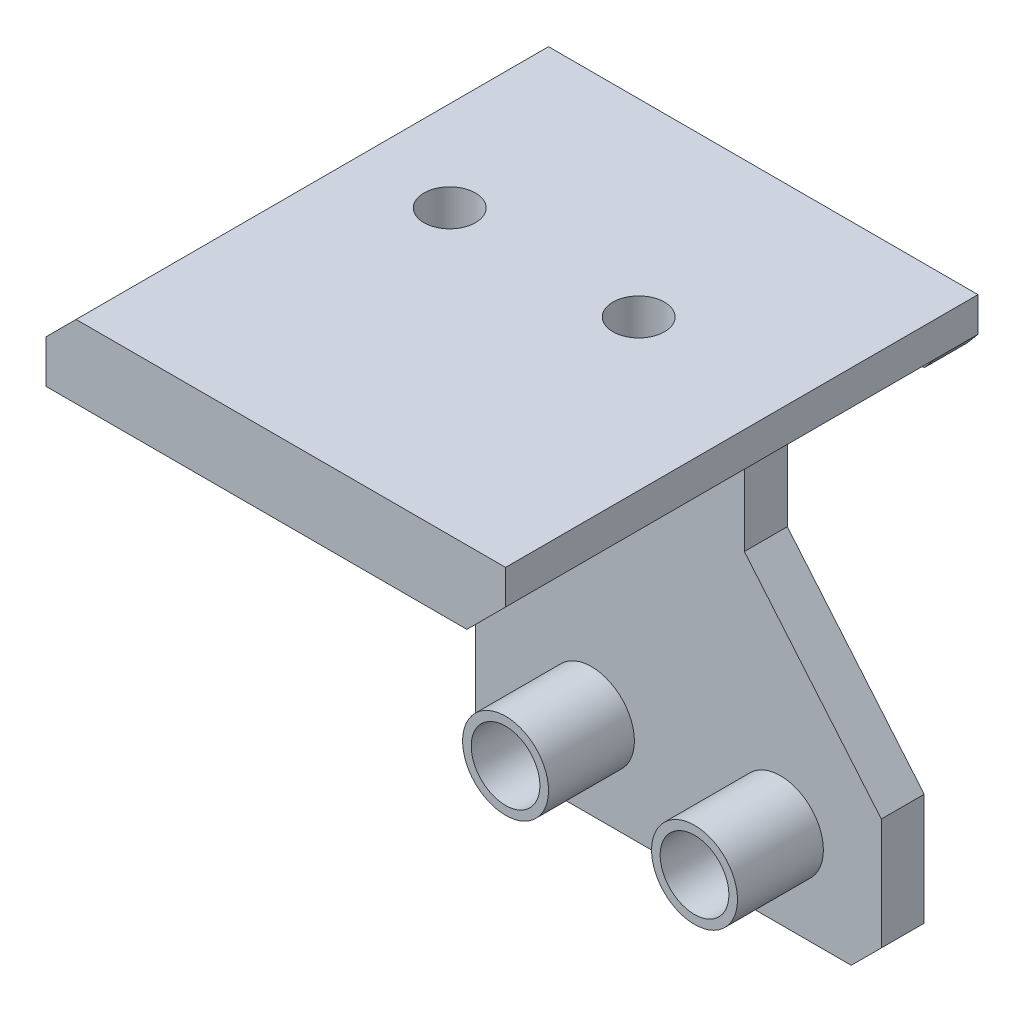
ISO-10303-21;
HEADER;
FILE_DESCRIPTION(('STEP AP214'),'2;1');
FILE_NAME('part.step','',(''),(''),'','','');
FILE_SCHEMA(('AUTOMOTIVE_DESIGN { 1 0 10303 214 1 1 1 1 }'));
ENDSEC;
DATA;
#1=APPLICATION_CONTEXT('core data for automotive mechanical design processes');
#2=APPLICATION_PROTOCOL_DEFINITION('international standard','automotive_design',2000,#1);
#3=PRODUCT_CONTEXT('',#1,'mechanical');
#4=PRODUCT('Part','Part','',(#3));
#5=PRODUCT_RELATED_PRODUCT_CATEGORY('part','',(#4));
#6=PRODUCT_DEFINITION_FORMATION('','',#4);
#7=PRODUCT_DEFINITION_CONTEXT('part definition',#1,'design');
#8=PRODUCT_DEFINITION('design','',#6,#7);
#9=PRODUCT_DEFINITION_SHAPE('','',#8);
#10=(LENGTH_UNIT() NAMED_UNIT(*) SI_UNIT(.MILLI.,.METRE.));
#11=(NAMED_UNIT(*) PLANE_ANGLE_UNIT() SI_UNIT($,.RADIAN.));
#12=(NAMED_UNIT(*) SI_UNIT($,.STERADIAN.) SOLID_ANGLE_UNIT());
#13=UNCERTAINTY_MEASURE_WITH_UNIT(LENGTH_MEASURE(1.E-05),#10,'distance_accuracy_value','');
#14=(GEOMETRIC_REPRESENTATION_CONTEXT(3) GLOBAL_UNCERTAINTY_ASSIGNED_CONTEXT((#13)) GLOBAL_UNIT_ASSIGNED_CONTEXT((#10,
#11,#12)) REPRESENTATION_CONTEXT('',''));
#15=CARTESIAN_POINT('',(0.,0.,0.));
#16=DIRECTION('',(0.,0.,1.));
#17=DIRECTION('',(1.,0.,0.));
#18=AXIS2_PLACEMENT_3D('',#15,#16,#17);
#19=CARTESIAN_POINT('',(14.,3.49999999999995,22.));
#20=DIRECTION('',(0.,-1.,0.));
#21=DIRECTION('',(1.,0.,0.));
#22=AXIS2_PLACEMENT_3D('',#19,#20,#21);
#23=CYLINDRICAL_SURFACE('',#22,3.);
#24=CARTESIAN_POINT('',(14.,3.49999999999995,22.));
#25=DIRECTION('',(0.,-1.,0.));
#26=DIRECTION('',(1.,0.,0.));
#27=AXIS2_PLACEMENT_3D('',#24,#25,#26);
#28=CIRCLE('',#27,3.);
#29=CARTESIAN_POINT('',(17.,3.49999999999995,22.));
#30=VERTEX_POINT('',#29);
#31=EDGE_CURVE('E378',#30,#30,#28,.T.);
#32=ORIENTED_EDGE('',*,*,#31,.F.);
#33=EDGE_LOOP('',(#32));
#34=FACE_BOUND('',#33,.T.);
#35=CARTESIAN_POINT('',(14.,-1.,22.));
#36=DIRECTION('',(0.,-1.,0.));
#37=DIRECTION('',(1.,0.,0.));
#38=AXIS2_PLACEMENT_3D('',#35,#36,#37);
#39=CIRCLE('',#38,3.);
#40=CARTESIAN_POINT('',(17.,-1.,22.));
#41=VERTEX_POINT('',#40);
#42=EDGE_CURVE('E415',#41,#41,#39,.T.);
#43=ORIENTED_EDGE('',*,*,#42,.T.);
#44=EDGE_LOOP('',(#43));
#45=FACE_BOUND('',#44,.T.);
#46=ADVANCED_FACE('F56',(#34,#45),#23,.F.);
#47=CARTESIAN_POINT('',(36.,3.49999999999995,22.));
#48=DIRECTION('',(0.,-1.,0.));
#49=DIRECTION('',(1.,0.,0.));
#50=AXIS2_PLACEMENT_3D('',#47,#48,#49);
#51=CYLINDRICAL_SURFACE('',#50,2.99999999999999);
#52=CARTESIAN_POINT('',(36.,3.49999999999995,22.));
#53=DIRECTION('',(0.,-1.,0.));
#54=DIRECTION('',(1.,0.,0.));
#55=AXIS2_PLACEMENT_3D('',#52,#53,#54);
#56=CIRCLE('',#55,2.99999999999999);
#57=CARTESIAN_POINT('',(39.,3.49999999999995,22.));
#58=VERTEX_POINT('',#57);
#59=EDGE_CURVE('E382',#58,#58,#56,.T.);
#60=ORIENTED_EDGE('',*,*,#59,.F.);
#61=EDGE_LOOP('',(#60));
#62=FACE_BOUND('',#61,.T.);
#63=CARTESIAN_POINT('',(36.,-1.,22.));
#64=DIRECTION('',(0.,-1.,0.));
#65=DIRECTION('',(1.,0.,0.));
#66=AXIS2_PLACEMENT_3D('',#63,#64,#65);
#67=CIRCLE('',#66,2.99999999999999);
#68=CARTESIAN_POINT('',(39.,-1.,22.));
#69=VERTEX_POINT('',#68);
#70=EDGE_CURVE('E428',#69,#69,#67,.T.);
#71=ORIENTED_EDGE('',*,*,#70,.T.);
#72=EDGE_LOOP('',(#71));
#73=FACE_BOUND('',#72,.T.);
#74=ADVANCED_FACE('F465',(#62,#73),#51,.F.);
#75=CARTESIAN_POINT('',(0.,0.,5.));
#76=DIRECTION('',(0.,0.,1.));
#77=DIRECTION('',(1.,0.,0.));
#78=AXIS2_PLACEMENT_3D('',#75,#76,#77);
#79=PLANE('',#78);
#80=CARTESIAN_POINT('',(35.5,-56.5,5.));
#81=DIRECTION('',(0.,0.,1.));
#82=DIRECTION('',(1.,0.,0.));
#83=AXIS2_PLACEMENT_3D('',#80,#81,#82);
#84=CIRCLE('',#83,5.);
#85=CARTESIAN_POINT('',(40.5,-56.5,5.));
#86=VERTEX_POINT('',#85);
#87=EDGE_CURVE('E399',#86,#86,#84,.T.);
#88=ORIENTED_EDGE('',*,*,#87,.F.);
#89=EDGE_LOOP('',(#88));
#90=FACE_BOUND('',#89,.T.);
#91=CARTESIAN_POINT('',(13.5000000000001,-56.5,5.));
#92=DIRECTION('',(0.,0.,1.));
#93=DIRECTION('',(1.,0.,0.));
#94=AXIS2_PLACEMENT_3D('',#91,#92,#93);
#95=CIRCLE('',#94,5.);
#96=CARTESIAN_POINT('',(18.5000000000001,-56.5,5.));
#97=VERTEX_POINT('',#96);
#98=EDGE_CURVE('E387',#97,#97,#95,.T.);
#99=ORIENTED_EDGE('',*,*,#98,.F.);
#100=EDGE_LOOP('',(#99));
#101=FACE_BOUND('',#100,.T.);
#102=DIRECTION('',(1.,0.,0.));
#103=VECTOR('',#102,1.);
#104=CARTESIAN_POINT('',(49.0000000000001,-5.,5.));
#105=LINE('',#104,#103);
#106=CARTESIAN_POINT('',(0.,-5.,5.));
#107=VERTEX_POINT('',#106);
#108=CARTESIAN_POINT('',(44.7240516597023,-5.,5.));
#109=VERTEX_POINT('',#108);
#110=EDGE_CURVE('E360',#107,#109,#105,.T.);
#111=ORIENTED_EDGE('',*,*,#110,.F.);
#112=DIRECTION('',(0.,-1.,0.));
#113=VECTOR('',#112,1.);
#114=CARTESIAN_POINT('',(0.,0.,5.));
#115=LINE('',#114,#113);
#116=CARTESIAN_POINT('',(0.,-63.0000000000001,5.));
#117=VERTEX_POINT('',#116);
#118=EDGE_CURVE('E218',#107,#117,#115,.T.);
#119=ORIENTED_EDGE('',*,*,#118,.T.);
#120=DIRECTION('',(0.707106781186547,-0.707106781186549,0.));
#121=VECTOR('',#120,1.);
#122=CARTESIAN_POINT('',(-31.5,-31.5,5.));
#123=LINE('',#122,#121);
#124=CARTESIAN_POINT('',(3.49999999999993,-66.5,5.));
#125=VERTEX_POINT('',#124);
#126=EDGE_CURVE('E221',#117,#125,#123,.T.);
#127=ORIENTED_EDGE('',*,*,#126,.T.);
#128=DIRECTION('',(1.,0.,0.));
#129=VECTOR('',#128,1.);
#130=CARTESIAN_POINT('',(0.,-66.5,5.));
#131=LINE('',#130,#129);
#132=CARTESIAN_POINT('',(43.7413505532341,-66.5,5.));
#133=VERTEX_POINT('',#132);
#134=EDGE_CURVE('E225',#125,#133,#131,.T.);
#135=ORIENTED_EDGE('',*,*,#134,.T.);
#136=DIRECTION('',(-0.70710678118655,-0.707106781186545,0.));
#137=VECTOR('',#136,1.);
#138=CARTESIAN_POINT('',(55.1206752766169,-55.1206752766172,5.));
#139=LINE('',#138,#137);
#140=CARTESIAN_POINT('',(47.2413505532341,-63.0000000000002,5.));
#141=VERTEX_POINT('',#140);
#142=EDGE_CURVE('E228',#141,#133,#139,.T.);
#143=ORIENTED_EDGE('',*,*,#142,.F.);
#144=DIRECTION('',(0.,1.,0.));
#145=VECTOR('',#144,1.);
#146=CARTESIAN_POINT('',(47.2413505532341,0.,5.));
#147=LINE('',#146,#145);
#148=CARTESIAN_POINT('',(47.2413505532341,-50.,5.));
#149=VERTEX_POINT('',#148);
#150=EDGE_CURVE('E232',#141,#149,#147,.T.);
#151=ORIENTED_EDGE('',*,*,#150,.T.);
#152=DIRECTION('',(-0.642787609686537,0.76604444311898,0.));
#153=VECTOR('',#152,1.);
#154=CARTESIAN_POINT('',(3.10216866835884,2.60302858546957,5.));
#155=LINE('',#154,#153);
#156=CARTESIAN_POINT('',(31.2984575608659,-31.0000000000001,5.));
#157=VERTEX_POINT('',#156);
#158=EDGE_CURVE('E235',#149,#157,#155,.T.);
#159=ORIENTED_EDGE('',*,*,#158,.T.);
#160=DIRECTION('',(0.,1.,0.));
#161=VECTOR('',#160,1.);
#162=CARTESIAN_POINT('',(31.2984575608659,0.,5.));
#163=LINE('',#162,#161);
#164=CARTESIAN_POINT('',(31.2984575608659,-21.0000000000001,5.));
#165=VERTEX_POINT('',#164);
#166=EDGE_CURVE('E238',#157,#165,#163,.T.);
#167=ORIENTED_EDGE('',*,*,#166,.T.);
#168=DIRECTION('',(0.642787609686536,0.766044443118981,0.));
#169=VECTOR('',#168,1.);
#170=CARTESIAN_POINT('',(28.7071702466764,-24.0881759661293,5.));
#171=LINE('',#170,#169);
#172=EDGE_CURVE('E241',#165,#109,#171,.T.);
#173=ORIENTED_EDGE('',*,*,#172,.T.);
#174=EDGE_LOOP('',(#111,#119,#127,#135,#143,#151,#159,#167,#173));
#175=FACE_BOUND('',#174,.T.);
#176=ADVANCED_FACE('F358',(#90,#101,#175),#79,.T.);
#177=CARTESIAN_POINT('',(0.,0.,5.));
#178=DIRECTION('',(0.707106781186547,-0.707106781186548,0.));
#179=DIRECTION('',(0.707106781186548,0.707106781186547,0.));
#180=AXIS2_PLACEMENT_3D('',#177,#178,#179);
#181=PLANE('',#180);
#182=DIRECTION('',(-0.707106781186548,-0.707106781186547,0.));
#183=VECTOR('',#182,1.);
#184=CARTESIAN_POINT('',(0.,0.,0.));
#185=LINE('',#184,#183);
#186=CARTESIAN_POINT('',(3.49999999999999,3.49999999999995,0.));
#187=VERTEX_POINT('',#186);
#188=CARTESIAN_POINT('',(0.,0.,0.));
#189=VERTEX_POINT('',#188);
#190=EDGE_CURVE('E206',#187,#189,#185,.T.);
#191=ORIENTED_EDGE('',*,*,#190,.T.);
#192=DIRECTION('',(0.,0.,-1.));
#193=VECTOR('',#192,1.);
#194=CARTESIAN_POINT('',(0.,0.,5.));
#195=LINE('',#194,#193);
#196=CARTESIAN_POINT('',(0.,0.,55.));
#197=VERTEX_POINT('',#196);
#198=EDGE_CURVE('E60',#197,#189,#195,.T.);
#199=ORIENTED_EDGE('',*,*,#198,.F.);
#200=DIRECTION('',(-0.707106781186547,-0.707106781186548,0.));
#201=VECTOR('',#200,1.);
#202=CARTESIAN_POINT('',(0.,0.,55.));
#203=LINE('',#202,#201);
#204=CARTESIAN_POINT('',(3.49999999999998,3.49999999999995,55.));
#205=VERTEX_POINT('',#204);
#206=EDGE_CURVE('E364',#205,#197,#203,.T.);
#207=ORIENTED_EDGE('',*,*,#206,.F.);
#208=DIRECTION('',(0.,0.,-1.));
#209=VECTOR('',#208,1.);
#210=CARTESIAN_POINT('',(3.49999999999999,3.49999999999995,5.));
#211=LINE('',#210,#209);
#212=EDGE_CURVE('E251',#205,#187,#211,.T.);
#213=ORIENTED_EDGE('',*,*,#212,.T.);
#214=EDGE_LOOP('',(#191,#199,#207,#213));
#215=FACE_BOUND('',#214,.T.);
#216=ADVANCED_FACE('F58',(#215),#181,.F.);
#217=CARTESIAN_POINT('',(0.,0.,5.));
#218=DIRECTION('',(1.,0.,0.));
#219=DIRECTION('',(0.,0.,-1.));
#220=AXIS2_PLACEMENT_3D('',#217,#218,#219);
#221=PLANE('',#220);
#222=DIRECTION('',(0.,-1.,0.));
#223=VECTOR('',#222,1.);
#224=CARTESIAN_POINT('',(0.,0.,0.));
#225=LINE('',#224,#223);
#226=CARTESIAN_POINT('',(0.,-63.0000000000001,0.));
#227=VERTEX_POINT('',#226);
#228=EDGE_CURVE('E212',#189,#227,#225,.T.);
#229=ORIENTED_EDGE('',*,*,#228,.T.);
#230=DIRECTION('',(0.,0.,-1.));
#231=VECTOR('',#230,1.);
#232=CARTESIAN_POINT('',(0.,-63.0000000000001,5.));
#233=LINE('',#232,#231);
#234=EDGE_CURVE('E329',#117,#227,#233,.T.);
#235=ORIENTED_EDGE('',*,*,#234,.F.);
#236=ORIENTED_EDGE('',*,*,#118,.F.);
#237=DIRECTION('',(0.,0.,-1.));
#238=VECTOR('',#237,1.);
#239=CARTESIAN_POINT('',(0.,-5.,55.));
#240=LINE('',#239,#238);
#241=CARTESIAN_POINT('',(0.,-5.,55.));
#242=VERTEX_POINT('',#241);
#243=EDGE_CURVE('E214',#242,#107,#240,.T.);
#244=ORIENTED_EDGE('',*,*,#243,.F.);
#245=DIRECTION('',(0.,-1.,0.));
#246=VECTOR('',#245,1.);
#247=CARTESIAN_POINT('',(0.,-5.,55.));
#248=LINE('',#247,#246);
#249=EDGE_CURVE('E194',#197,#242,#248,.T.);
#250=ORIENTED_EDGE('',*,*,#249,.F.);
#251=ORIENTED_EDGE('',*,*,#198,.T.);
#252=EDGE_LOOP('',(#229,#235,#236,#244,#250,#251));
#253=FACE_BOUND('',#252,.T.);
#254=ADVANCED_FACE('F341',(#253),#221,.F.);
#255=CARTESIAN_POINT('',(-31.5,-31.5,5.));
#256=DIRECTION('',(0.707106781186549,0.707106781186547,0.));
#257=DIRECTION('',(-0.707106781186547,0.707106781186549,0.));
#258=AXIS2_PLACEMENT_3D('',#255,#256,#257);
#259=PLANE('',#258);
#260=DIRECTION('',(0.707106781186547,-0.707106781186549,0.));
#261=VECTOR('',#260,1.);
#262=CARTESIAN_POINT('',(-31.5,-31.5,0.));
#263=LINE('',#262,#261);
#264=CARTESIAN_POINT('',(3.49999999999993,-66.5,0.));
#265=VERTEX_POINT('',#264);
#266=EDGE_CURVE('E255',#227,#265,#263,.T.);
#267=ORIENTED_EDGE('',*,*,#266,.T.);
#268=DIRECTION('',(0.,0.,-1.));
#269=VECTOR('',#268,1.);
#270=CARTESIAN_POINT('',(3.49999999999993,-66.5,5.));
#271=LINE('',#270,#269);
#272=EDGE_CURVE('E326',#125,#265,#271,.T.);
#273=ORIENTED_EDGE('',*,*,#272,.F.);
#274=ORIENTED_EDGE('',*,*,#126,.F.);
#275=ORIENTED_EDGE('',*,*,#234,.T.);
#276=EDGE_LOOP('',(#267,#273,#274,#275));
#277=FACE_BOUND('',#276,.T.);
#278=ADVANCED_FACE('F351',(#277),#259,.F.);
#279=CARTESIAN_POINT('',(0.,-66.5,5.));
#280=DIRECTION('',(0.,1.,0.));
#281=DIRECTION('',(0.,0.,1.));
#282=AXIS2_PLACEMENT_3D('',#279,#280,#281);
#283=PLANE('',#282);
#284=DIRECTION('',(1.,0.,0.));
#285=VECTOR('',#284,1.);
#286=CARTESIAN_POINT('',(0.,-66.5,0.));
#287=LINE('',#286,#285);
#288=CARTESIAN_POINT('',(43.7413505532341,-66.5,0.));
#289=VERTEX_POINT('',#288);
#290=EDGE_CURVE('E258',#265,#289,#287,.T.);
#291=ORIENTED_EDGE('',*,*,#290,.T.);
#292=DIRECTION('',(0.,0.,-1.));
#293=VECTOR('',#292,1.);
#294=CARTESIAN_POINT('',(43.7413505532341,-66.5,5.));
#295=LINE('',#294,#293);
#296=EDGE_CURVE('E323',#133,#289,#295,.T.);
#297=ORIENTED_EDGE('',*,*,#296,.F.);
#298=ORIENTED_EDGE('',*,*,#134,.F.);
#299=ORIENTED_EDGE('',*,*,#272,.T.);
#300=EDGE_LOOP('',(#291,#297,#298,#299));
#301=FACE_BOUND('',#300,.T.);
#302=ADVANCED_FACE('F354',(#301),#283,.F.);
#303=CARTESIAN_POINT('',(55.1206752766169,-55.1206752766172,5.));
#304=DIRECTION('',(0.707106781186545,-0.70710678118655,0.));
#305=DIRECTION('',(0.70710678118655,0.707106781186545,0.));
#306=AXIS2_PLACEMENT_3D('',#303,#304,#305);
#307=PLANE('',#306);
#308=DIRECTION('',(-0.70710678118655,-0.707106781186545,0.));
#309=VECTOR('',#308,1.);
#310=CARTESIAN_POINT('',(55.1206752766169,-55.1206752766172,0.));
#311=LINE('',#310,#309);
#312=CARTESIAN_POINT('',(47.2413505532341,-63.0000000000002,0.));
#313=VERTEX_POINT('',#312);
#314=EDGE_CURVE('E262',#313,#289,#311,.T.);
#315=ORIENTED_EDGE('',*,*,#314,.F.);
#316=DIRECTION('',(0.,0.,-1.));
#317=VECTOR('',#316,1.);
#318=CARTESIAN_POINT('',(47.2413505532341,-63.0000000000002,5.));
#319=LINE('',#318,#317);
#320=EDGE_CURVE('E320',#141,#313,#319,.T.);
#321=ORIENTED_EDGE('',*,*,#320,.F.);
#322=ORIENTED_EDGE('',*,*,#142,.T.);
#323=ORIENTED_EDGE('',*,*,#296,.T.);
#324=EDGE_LOOP('',(#315,#321,#322,#323));
#325=FACE_BOUND('',#324,.T.);
#326=ADVANCED_FACE('F524',(#325),#307,.T.);
#327=CARTESIAN_POINT('',(47.2413505532341,0.,5.));
#328=DIRECTION('',(-1.,0.,0.));
#329=DIRECTION('',(0.,0.,1.));
#330=AXIS2_PLACEMENT_3D('',#327,#328,#329);
#331=PLANE('',#330);
#332=DIRECTION('',(0.,1.,0.));
#333=VECTOR('',#332,1.);
#334=CARTESIAN_POINT('',(47.2413505532341,0.,0.));
#335=LINE('',#334,#333);
#336=CARTESIAN_POINT('',(47.2413505532341,-50.,0.));
#337=VERTEX_POINT('',#336);
#338=EDGE_CURVE('E266',#313,#337,#335,.T.);
#339=ORIENTED_EDGE('',*,*,#338,.T.);
#340=DIRECTION('',(0.,0.,-1.));
#341=VECTOR('',#340,1.);
#342=CARTESIAN_POINT('',(47.2413505532341,-50.,5.));
#343=LINE('',#342,#341);
#344=EDGE_CURVE('E316',#149,#337,#343,.T.);
#345=ORIENTED_EDGE('',*,*,#344,.F.);
#346=ORIENTED_EDGE('',*,*,#150,.F.);
#347=ORIENTED_EDGE('',*,*,#320,.T.);
#348=EDGE_LOOP('',(#339,#345,#346,#347));
#349=FACE_BOUND('',#348,.T.);
#350=ADVANCED_FACE('F520',(#349),#331,.F.);
#351=CARTESIAN_POINT('',(3.10216866835884,2.60302858546957,5.));
#352=DIRECTION('',(-0.76604444311898,-0.642787609686537,0.));
#353=DIRECTION('',(0.642787609686537,-0.76604444311898,0.));
#354=AXIS2_PLACEMENT_3D('',#351,#352,#353);
#355=PLANE('',#354);
#356=DIRECTION('',(-0.642787609686537,0.76604444311898,0.));
#357=VECTOR('',#356,1.);
#358=CARTESIAN_POINT('',(3.10216866835884,2.60302858546957,0.));
#359=LINE('',#358,#357);
#360=CARTESIAN_POINT('',(31.2984575608659,-31.0000000000001,0.));
#361=VERTEX_POINT('',#360);
#362=EDGE_CURVE('E269',#337,#361,#359,.T.);
#363=ORIENTED_EDGE('',*,*,#362,.T.);
#364=DIRECTION('',(0.,0.,-1.));
#365=VECTOR('',#364,1.);
#366=CARTESIAN_POINT('',(31.2984575608659,-31.0000000000001,5.));
#367=LINE('',#366,#365);
#368=EDGE_CURVE('E312',#157,#361,#367,.T.);
#369=ORIENTED_EDGE('',*,*,#368,.F.);
#370=ORIENTED_EDGE('',*,*,#158,.F.);
#371=ORIENTED_EDGE('',*,*,#344,.T.);
#372=EDGE_LOOP('',(#363,#369,#370,#371));
#373=FACE_BOUND('',#372,.T.);
#374=ADVANCED_FACE('F516',(#373),#355,.F.);
#375=CARTESIAN_POINT('',(31.2984575608659,0.,5.));
#376=DIRECTION('',(-1.,0.,0.));
#377=DIRECTION('',(0.,-1.,0.));
#378=AXIS2_PLACEMENT_3D('',#375,#376,#377);
#379=PLANE('',#378);
#380=DIRECTION('',(0.,1.,0.));
#381=VECTOR('',#380,1.);
#382=CARTESIAN_POINT('',(31.2984575608659,0.,0.));
#383=LINE('',#382,#381);
#384=CARTESIAN_POINT('',(31.2984575608659,-21.0000000000001,0.));
#385=VERTEX_POINT('',#384);
#386=EDGE_CURVE('E272',#361,#385,#383,.T.);
#387=ORIENTED_EDGE('',*,*,#386,.T.);
#388=DIRECTION('',(0.,0.,-1.));
#389=VECTOR('',#388,1.);
#390=CARTESIAN_POINT('',(31.2984575608659,-21.0000000000001,5.));
#391=LINE('',#390,#389);
#392=EDGE_CURVE('E308',#165,#385,#391,.T.);
#393=ORIENTED_EDGE('',*,*,#392,.F.);
#394=ORIENTED_EDGE('',*,*,#166,.F.);
#395=ORIENTED_EDGE('',*,*,#368,.T.);
#396=EDGE_LOOP('',(#387,#393,#394,#395));
#397=FACE_BOUND('',#396,.T.);
#398=ADVANCED_FACE('F513',(#397),#379,.F.);
#399=CARTESIAN_POINT('',(28.7071702466764,-24.0881759661293,5.));
#400=DIRECTION('',(-0.766044443118981,0.642787609686536,0.));
#401=DIRECTION('',(-0.642787609686536,-0.766044443118981,0.));
#402=AXIS2_PLACEMENT_3D('',#399,#400,#401);
#403=PLANE('',#402);
#404=DIRECTION('',(0.642787609686536,0.766044443118981,0.));
#405=VECTOR('',#404,1.);
#406=CARTESIAN_POINT('',(28.7071702466764,-24.0881759661293,0.));
#407=LINE('',#406,#405);
#408=CARTESIAN_POINT('',(47.2413505532341,-2.00000000000011,0.));
#409=VERTEX_POINT('',#408);
#410=EDGE_CURVE('E275',#385,#409,#407,.T.);
#411=ORIENTED_EDGE('',*,*,#410,.T.);
#412=DIRECTION('',(0.,0.,-1.));
#413=VECTOR('',#412,1.);
#414=CARTESIAN_POINT('',(47.2413505532341,-2.00000000000011,5.));
#415=LINE('',#414,#413);
#416=CARTESIAN_POINT('',(47.2413505532341,-2.00000000000011,5.));
#417=VERTEX_POINT('',#416);
#418=EDGE_CURVE('E304',#417,#409,#415,.T.);
#419=ORIENTED_EDGE('',*,*,#418,.F.);
#420=EDGE_CURVE('E80',#109,#417,#171,.T.);
#421=ORIENTED_EDGE('',*,*,#420,.F.);
#422=ORIENTED_EDGE('',*,*,#172,.F.);
#423=ORIENTED_EDGE('',*,*,#392,.T.);
#424=EDGE_LOOP('',(#411,#419,#421,#422,#423));
#425=FACE_BOUND('',#424,.T.);
#426=ADVANCED_FACE('F509',(#425),#403,.F.);
#427=CARTESIAN_POINT('',(0.,-2.00000000000011,5.));
#428=DIRECTION('',(0.,1.,0.));
#429=DIRECTION('',(-1.,0.,0.));
#430=AXIS2_PLACEMENT_3D('',#427,#428,#429);
#431=PLANE('',#430);
#432=DIRECTION('',(1.,0.,0.));
#433=VECTOR('',#432,1.);
#434=CARTESIAN_POINT('',(0.,-2.00000000000011,0.));
#435=LINE('',#434,#433);
#436=CARTESIAN_POINT('',(52.2413505532341,-2.00000000000011,0.));
#437=VERTEX_POINT('',#436);
#438=EDGE_CURVE('E278',#409,#437,#435,.T.);
#439=ORIENTED_EDGE('',*,*,#438,.T.);
#440=DIRECTION('',(0.,0.,-1.));
#441=VECTOR('',#440,1.);
#442=CARTESIAN_POINT('',(52.2413505532341,-2.00000000000011,5.));
#443=LINE('',#442,#441);
#444=CARTESIAN_POINT('',(52.2413505532341,-2.00000000000011,5.));
#445=VERTEX_POINT('',#444);
#446=EDGE_CURVE('E300',#445,#437,#443,.T.);
#447=ORIENTED_EDGE('',*,*,#446,.F.);
#448=DIRECTION('',(1.,0.,0.));
#449=VECTOR('',#448,1.);
#450=CARTESIAN_POINT('',(0.,-2.00000000000011,5.));
#451=LINE('',#450,#449);
#452=CARTESIAN_POINT('',(52.,-2.00000000000011,5.));
#453=VERTEX_POINT('',#452);
#454=EDGE_CURVE('E244',#453,#445,#451,.T.);
#455=ORIENTED_EDGE('',*,*,#454,.F.);
#456=EDGE_CURVE('E245',#417,#453,#451,.T.);
#457=ORIENTED_EDGE('',*,*,#456,.F.);
#458=ORIENTED_EDGE('',*,*,#418,.T.);
#459=EDGE_LOOP('',(#439,#447,#455,#457,#458));
#460=FACE_BOUND('',#459,.T.);
#461=ADVANCED_FACE('F505',(#460),#431,.F.);
#462=CARTESIAN_POINT('',(31.6412906908436,-26.5501953486599,5.));
#463=DIRECTION('',(-0.766044443118979,0.642787609686538,0.));
#464=DIRECTION('',(-0.642787609686538,-0.766044443118979,0.));
#465=AXIS2_PLACEMENT_3D('',#462,#463,#464);
#466=PLANE('',#465);
#467=DIRECTION('',(0.642787609686538,0.766044443118979,0.));
#468=VECTOR('',#467,1.);
#469=CARTESIAN_POINT('',(31.6412906908436,-26.5501953486599,0.));
#470=LINE('',#469,#468);
#471=CARTESIAN_POINT('',(53.5,-0.500000000000056,0.));
#472=VERTEX_POINT('',#471);
#473=EDGE_CURVE('E281',#437,#472,#470,.T.);
#474=ORIENTED_EDGE('',*,*,#473,.T.);
#475=DIRECTION('',(0.,0.,-1.));
#476=VECTOR('',#475,1.);
#477=CARTESIAN_POINT('',(53.5,-0.500000000000056,5.));
#478=LINE('',#477,#476);
#479=CARTESIAN_POINT('',(53.5,-0.500000000000056,5.));
#480=VERTEX_POINT('',#479);
#481=EDGE_CURVE('E296',#480,#472,#478,.T.);
#482=ORIENTED_EDGE('',*,*,#481,.F.);
#483=DIRECTION('',(0.642787609686538,0.766044443118979,0.));
#484=VECTOR('',#483,1.);
#485=CARTESIAN_POINT('',(31.6412906908436,-26.5501953486599,5.));
#486=LINE('',#485,#484);
#487=EDGE_CURVE('E249',#445,#480,#486,.T.);
#488=ORIENTED_EDGE('',*,*,#487,.F.);
#489=ORIENTED_EDGE('',*,*,#446,.T.);
#490=EDGE_LOOP('',(#474,#482,#488,#489));
#491=FACE_BOUND('',#490,.T.);
#492=ADVANCED_FACE('F501',(#491),#466,.F.);
#493=CARTESIAN_POINT('',(53.5,0.,5.));
#494=DIRECTION('',(-1.,0.,0.));
#495=DIRECTION('',(0.,0.,1.));
#496=AXIS2_PLACEMENT_3D('',#493,#494,#495);
#497=PLANE('',#496);
#498=DIRECTION('',(0.,1.,0.));
#499=VECTOR('',#498,1.);
#500=CARTESIAN_POINT('',(53.5,0.,0.));
#501=LINE('',#500,#499);
#502=CARTESIAN_POINT('',(53.5,3.49999999999995,0.));
#503=VERTEX_POINT('',#502);
#504=EDGE_CURVE('E284',#472,#503,#501,.T.);
#505=ORIENTED_EDGE('',*,*,#504,.T.);
#506=DIRECTION('',(0.,0.,-1.));
#507=VECTOR('',#506,1.);
#508=CARTESIAN_POINT('',(53.5,3.49999999999995,5.));
#509=LINE('',#508,#507);
#510=CARTESIAN_POINT('',(53.5,3.49999999999995,55.));
#511=VERTEX_POINT('',#510);
#512=EDGE_CURVE('E292',#511,#503,#509,.T.);
#513=ORIENTED_EDGE('',*,*,#512,.F.);
#514=DIRECTION('',(0.,1.,0.));
#515=VECTOR('',#514,1.);
#516=CARTESIAN_POINT('',(53.5,3.49999999999995,55.));
#517=LINE('',#516,#515);
#518=CARTESIAN_POINT('',(53.5,-0.500000000000056,55.));
#519=VERTEX_POINT('',#518);
#520=EDGE_CURVE('E187',#519,#511,#517,.T.);
#521=ORIENTED_EDGE('',*,*,#520,.F.);
#522=DIRECTION('',(0.,0.,-1.));
#523=VECTOR('',#522,1.);
#524=CARTESIAN_POINT('',(53.5,-0.500000000000056,55.));
#525=LINE('',#524,#523);
#526=EDGE_CURVE('E182',#519,#480,#525,.T.);
#527=ORIENTED_EDGE('',*,*,#526,.T.);
#528=ORIENTED_EDGE('',*,*,#481,.T.);
#529=EDGE_LOOP('',(#505,#513,#521,#527,#528));
#530=FACE_BOUND('',#529,.T.);
#531=ADVANCED_FACE('F497',(#530),#497,.F.);
#532=CARTESIAN_POINT('',(0.,3.49999999999995,5.));
#533=DIRECTION('',(0.,-1.,0.));
#534=DIRECTION('',(0.,0.,-1.));
#535=AXIS2_PLACEMENT_3D('',#532,#533,#534);
#536=PLANE('',#535);
#537=ORIENTED_EDGE('',*,*,#59,.T.);
#538=EDGE_LOOP('',(#537));
#539=FACE_BOUND('',#538,.T.);
#540=ORIENTED_EDGE('',*,*,#31,.T.);
#541=EDGE_LOOP('',(#540));
#542=FACE_BOUND('',#541,.T.);
#543=DIRECTION('',(-1.,0.,0.));
#544=VECTOR('',#543,1.);
#545=CARTESIAN_POINT('',(0.,3.49999999999995,0.));
#546=LINE('',#545,#544);
#547=EDGE_CURVE('E222',#503,#187,#546,.T.);
#548=ORIENTED_EDGE('',*,*,#547,.T.);
#549=ORIENTED_EDGE('',*,*,#212,.F.);
#550=DIRECTION('',(-1.,0.,0.));
#551=VECTOR('',#550,1.);
#552=CARTESIAN_POINT('',(3.49999999999998,3.49999999999995,55.));
#553=LINE('',#552,#551);
#554=EDGE_CURVE('E372',#511,#205,#553,.T.);
#555=ORIENTED_EDGE('',*,*,#554,.F.);
#556=ORIENTED_EDGE('',*,*,#512,.T.);
#557=EDGE_LOOP('',(#548,#549,#555,#556));
#558=FACE_BOUND('',#557,.T.);
#559=ADVANCED_FACE('F492',(#539,#542,#558),#536,.F.);
#560=DIRECTION('',(0.707106781186547,0.707106781186548,0.));
#561=VECTOR('',#560,1.);
#562=CARTESIAN_POINT('',(53.5,-0.500000000000056,5.));
#563=LINE('',#562,#561);
#564=EDGE_CURVE('E13',#453,#480,#563,.T.);
#565=ORIENTED_EDGE('',*,*,#564,.F.);
#566=ORIENTED_EDGE('',*,*,#454,.T.);
#567=ORIENTED_EDGE('',*,*,#487,.T.);
#568=EDGE_LOOP('',(#565,#566,#567));
#569=FACE_BOUND('',#568,.T.);
#570=ADVANCED_FACE('F489',(#569),#79,.T.);
#571=CARTESIAN_POINT('',(0.,0.,0.));
#572=DIRECTION('',(0.,0.,1.));
#573=DIRECTION('',(1.,0.,0.));
#574=AXIS2_PLACEMENT_3D('',#571,#572,#573);
#575=PLANE('',#574);
#576=CARTESIAN_POINT('',(35.5,-56.5,0.));
#577=DIRECTION('',(0.,0.,1.));
#578=DIRECTION('',(1.,0.,0.));
#579=AXIS2_PLACEMENT_3D('',#576,#577,#578);
#580=CIRCLE('',#579,4.);
#581=CARTESIAN_POINT('',(39.5,-56.5,0.));
#582=VERTEX_POINT('',#581);
#583=EDGE_CURVE('E416',#582,#582,#580,.T.);
#584=ORIENTED_EDGE('',*,*,#583,.T.);
#585=EDGE_LOOP('',(#584));
#586=FACE_BOUND('',#585,.T.);
#587=CARTESIAN_POINT('',(13.5000000000001,-56.5,0.));
#588=DIRECTION('',(0.,0.,1.));
#589=DIRECTION('',(1.,0.,0.));
#590=AXIS2_PLACEMENT_3D('',#587,#588,#589);
#591=CIRCLE('',#590,4.);
#592=CARTESIAN_POINT('',(17.5000000000001,-56.5,0.));
#593=VERTEX_POINT('',#592);
#594=EDGE_CURVE('E435',#593,#593,#591,.T.);
#595=ORIENTED_EDGE('',*,*,#594,.T.);
#596=EDGE_LOOP('',(#595));
#597=FACE_BOUND('',#596,.T.);
#598=ORIENTED_EDGE('',*,*,#190,.F.);
#599=ORIENTED_EDGE('',*,*,#547,.F.);
#600=ORIENTED_EDGE('',*,*,#504,.F.);
#601=ORIENTED_EDGE('',*,*,#473,.F.);
#602=ORIENTED_EDGE('',*,*,#438,.F.);
#603=ORIENTED_EDGE('',*,*,#410,.F.);
#604=ORIENTED_EDGE('',*,*,#386,.F.);
#605=ORIENTED_EDGE('',*,*,#362,.F.);
#606=ORIENTED_EDGE('',*,*,#338,.F.);
#607=ORIENTED_EDGE('',*,*,#314,.T.);
#608=ORIENTED_EDGE('',*,*,#290,.F.);
#609=ORIENTED_EDGE('',*,*,#266,.F.);
#610=ORIENTED_EDGE('',*,*,#228,.F.);
#611=EDGE_LOOP('',(#598,#599,#600,#601,#602,#603,#604,#605,#606,#607,#608,#609,#610));
#612=FACE_BOUND('',#611,.T.);
#613=ADVANCED_FACE('F347',(#586,#597,#612),#575,.F.);
#614=CARTESIAN_POINT('',(49.0000000000001,-5.,55.));
#615=DIRECTION('',(0.,1.,0.));
#616=DIRECTION('',(-1.,0.,0.));
#617=AXIS2_PLACEMENT_3D('',#614,#615,#616);
#618=PLANE('',#617);
#619=CARTESIAN_POINT('',(36.,-5.,22.));
#620=DIRECTION('',(0.,-1.,0.));
#621=DIRECTION('',(1.,0.,0.));
#622=AXIS2_PLACEMENT_3D('',#619,#620,#621);
#623=CIRCLE('',#622,5.);
#624=CARTESIAN_POINT('',(41.,-5.,22.));
#625=VERTEX_POINT('',#624);
#626=EDGE_CURVE('E421',#625,#625,#623,.T.);
#627=ORIENTED_EDGE('',*,*,#626,.F.);
#628=EDGE_LOOP('',(#627));
#629=FACE_BOUND('',#628,.T.);
#630=CARTESIAN_POINT('',(14.,-5.,22.));
#631=DIRECTION('',(0.,-1.,0.));
#632=DIRECTION('',(1.,0.,0.));
#633=AXIS2_PLACEMENT_3D('',#630,#631,#632);
#634=CIRCLE('',#633,5.);
#635=CARTESIAN_POINT('',(19.,-5.,22.));
#636=VERTEX_POINT('',#635);
#637=EDGE_CURVE('E411',#636,#636,#634,.T.);
#638=ORIENTED_EDGE('',*,*,#637,.F.);
#639=EDGE_LOOP('',(#638));
#640=FACE_BOUND('',#639,.T.);
#641=ORIENTED_EDGE('',*,*,#110,.T.);
#642=CARTESIAN_POINT('',(49.0000000000001,-5.,5.));
#643=VERTEX_POINT('',#642);
#644=EDGE_CURVE('E203',#109,#643,#105,.T.);
#645=ORIENTED_EDGE('',*,*,#644,.T.);
#646=DIRECTION('',(0.,0.,-1.));
#647=VECTOR('',#646,1.);
#648=CARTESIAN_POINT('',(49.0000000000001,-5.,55.));
#649=LINE('',#648,#647);
#650=CARTESIAN_POINT('',(49.0000000000001,-5.,55.));
#651=VERTEX_POINT('',#650);
#652=EDGE_CURVE('E180',#651,#643,#649,.T.);
#653=ORIENTED_EDGE('',*,*,#652,.F.);
#654=DIRECTION('',(1.,0.,0.));
#655=VECTOR('',#654,1.);
#656=CARTESIAN_POINT('',(49.0000000000001,-5.,55.));
#657=LINE('',#656,#655);
#658=EDGE_CURVE('E188',#242,#651,#657,.T.);
#659=ORIENTED_EDGE('',*,*,#658,.F.);
#660=ORIENTED_EDGE('',*,*,#243,.T.);
#661=EDGE_LOOP('',(#641,#645,#653,#659,#660));
#662=FACE_BOUND('',#661,.T.);
#663=ADVANCED_FACE('F201',(#629,#640,#662),#618,.F.);
#664=CARTESIAN_POINT('',(53.5,-0.500000000000056,55.));
#665=DIRECTION('',(-0.707106781186548,0.707106781186547,0.));
#666=DIRECTION('',(-0.707106781186547,-0.707106781186548,0.));
#667=AXIS2_PLACEMENT_3D('',#664,#665,#666);
#668=PLANE('',#667);
#669=EDGE_CURVE('E67',#643,#453,#563,.T.);
#670=ORIENTED_EDGE('',*,*,#669,.T.);
#671=ORIENTED_EDGE('',*,*,#564,.T.);
#672=ORIENTED_EDGE('',*,*,#526,.F.);
#673=DIRECTION('',(0.707106781186547,0.707106781186548,0.));
#674=VECTOR('',#673,1.);
#675=CARTESIAN_POINT('',(53.5,-0.500000000000056,55.));
#676=LINE('',#675,#674);
#677=EDGE_CURVE('E175',#651,#519,#676,.T.);
#678=ORIENTED_EDGE('',*,*,#677,.F.);
#679=ORIENTED_EDGE('',*,*,#652,.T.);
#680=EDGE_LOOP('',(#670,#671,#672,#678,#679));
#681=FACE_BOUND('',#680,.T.);
#682=ADVANCED_FACE('F178',(#681),#668,.F.);
#683=CARTESIAN_POINT('',(0.,0.,55.));
#684=DIRECTION('',(0.,0.,-1.));
#685=DIRECTION('',(-1.,0.,0.));
#686=AXIS2_PLACEMENT_3D('',#683,#684,#685);
#687=PLANE('',#686);
#688=ORIENTED_EDGE('',*,*,#658,.T.);
#689=ORIENTED_EDGE('',*,*,#677,.T.);
#690=ORIENTED_EDGE('',*,*,#520,.T.);
#691=ORIENTED_EDGE('',*,*,#554,.T.);
#692=ORIENTED_EDGE('',*,*,#206,.T.);
#693=ORIENTED_EDGE('',*,*,#249,.T.);
#694=EDGE_LOOP('',(#688,#689,#690,#691,#692,#693));
#695=FACE_BOUND('',#694,.T.);
#696=ADVANCED_FACE('F191',(#695),#687,.F.);
#697=CARTESIAN_POINT('',(0.,0.,5.));
#698=DIRECTION('',(0.,0.,-1.));
#699=DIRECTION('',(-1.,0.,0.));
#700=AXIS2_PLACEMENT_3D('',#697,#698,#699);
#701=PLANE('',#700);
#702=ORIENTED_EDGE('',*,*,#644,.F.);
#703=ORIENTED_EDGE('',*,*,#420,.T.);
#704=ORIENTED_EDGE('',*,*,#456,.T.);
#705=ORIENTED_EDGE('',*,*,#669,.F.);
#706=EDGE_LOOP('',(#702,#703,#704,#705));
#707=FACE_BOUND('',#706,.T.);
#708=ADVANCED_FACE('F479',(#707),#701,.T.);
#709=CARTESIAN_POINT('',(13.5000000000001,-56.5,15.));
#710=DIRECTION('',(0.,0.,1.));
#711=DIRECTION('',(1.,0.,0.));
#712=AXIS2_PLACEMENT_3D('',#709,#710,#711);
#713=PLANE('',#712);
#714=CARTESIAN_POINT('',(13.5000000000001,-56.5,15.));
#715=DIRECTION('',(0.,0.,1.));
#716=DIRECTION('',(1.,0.,0.));
#717=AXIS2_PLACEMENT_3D('',#714,#715,#716);
#718=CIRCLE('',#717,5.);
#719=CARTESIAN_POINT('',(18.5000000000001,-56.5,15.));
#720=VERTEX_POINT('',#719);
#721=EDGE_CURVE('E383',#720,#720,#718,.T.);
#722=ORIENTED_EDGE('',*,*,#721,.T.);
#723=EDGE_LOOP('',(#722));
#724=FACE_BOUND('',#723,.T.);
#725=CARTESIAN_POINT('',(13.5000000000001,-56.5,15.));
#726=DIRECTION('',(0.,0.,1.));
#727=DIRECTION('',(1.,0.,0.));
#728=AXIS2_PLACEMENT_3D('',#725,#726,#727);
#729=CIRCLE('',#728,4.00000000000001);
#730=CARTESIAN_POINT('',(17.5000000000001,-56.5,15.));
#731=VERTEX_POINT('',#730);
#732=EDGE_CURVE('E391',#731,#731,#729,.T.);
#733=ORIENTED_EDGE('',*,*,#732,.F.);
#734=EDGE_LOOP('',(#733));
#735=FACE_BOUND('',#734,.T.);
#736=ADVANCED_FACE('F482',(#724,#735),#713,.T.);
#737=CARTESIAN_POINT('',(13.5000000000001,-56.5,15.));
#738=DIRECTION('',(0.,0.,-1.));
#739=DIRECTION('',(-1.,0.,0.));
#740=AXIS2_PLACEMENT_3D('',#737,#738,#739);
#741=CYLINDRICAL_SURFACE('',#740,5.);
#742=ORIENTED_EDGE('',*,*,#721,.F.);
#743=EDGE_LOOP('',(#742));
#744=FACE_BOUND('',#743,.T.);
#745=ORIENTED_EDGE('',*,*,#98,.T.);
#746=EDGE_LOOP('',(#745));
#747=FACE_BOUND('',#746,.T.);
#748=ADVANCED_FACE('F546',(#744,#747),#741,.T.);
#749=CARTESIAN_POINT('',(13.5000000000001,-56.5,15.));
#750=DIRECTION('',(0.,0.,-1.));
#751=DIRECTION('',(-1.,0.,0.));
#752=AXIS2_PLACEMENT_3D('',#749,#750,#751);
#753=CYLINDRICAL_SURFACE('',#752,4.00000000000001);
#754=ORIENTED_EDGE('',*,*,#732,.T.);
#755=EDGE_LOOP('',(#754));
#756=FACE_BOUND('',#755,.T.);
#757=ORIENTED_EDGE('',*,*,#594,.F.);
#758=EDGE_LOOP('',(#757));
#759=FACE_BOUND('',#758,.T.);
#760=ADVANCED_FACE('F548',(#756,#759),#753,.F.);
#761=CARTESIAN_POINT('',(35.5,-56.5,15.));
#762=DIRECTION('',(0.,0.,1.));
#763=DIRECTION('',(1.,0.,0.));
#764=AXIS2_PLACEMENT_3D('',#761,#762,#763);
#765=PLANE('',#764);
#766=CARTESIAN_POINT('',(35.5,-56.5,15.));
#767=DIRECTION('',(0.,0.,1.));
#768=DIRECTION('',(1.,0.,0.));
#769=AXIS2_PLACEMENT_3D('',#766,#767,#768);
#770=CIRCLE('',#769,5.);
#771=CARTESIAN_POINT('',(40.5,-56.5,15.));
#772=VERTEX_POINT('',#771);
#773=EDGE_CURVE('E398',#772,#772,#770,.T.);
#774=ORIENTED_EDGE('',*,*,#773,.T.);
#775=EDGE_LOOP('',(#774));
#776=FACE_BOUND('',#775,.T.);
#777=CARTESIAN_POINT('',(35.5,-56.5,15.));
#778=DIRECTION('',(0.,0.,1.));
#779=DIRECTION('',(1.,0.,0.));
#780=AXIS2_PLACEMENT_3D('',#777,#778,#779);
#781=CIRCLE('',#780,4.);
#782=CARTESIAN_POINT('',(39.5,-56.5,15.));
#783=VERTEX_POINT('',#782);
#784=EDGE_CURVE('E403',#783,#783,#781,.T.);
#785=ORIENTED_EDGE('',*,*,#784,.F.);
#786=EDGE_LOOP('',(#785));
#787=FACE_BOUND('',#786,.T.);
#788=ADVANCED_FACE('F459',(#776,#787),#765,.T.);
#789=CARTESIAN_POINT('',(35.5,-56.5,15.));
#790=DIRECTION('',(0.,0.,-1.));
#791=DIRECTION('',(-1.,0.,0.));
#792=AXIS2_PLACEMENT_3D('',#789,#790,#791);
#793=CYLINDRICAL_SURFACE('',#792,5.);
#794=ORIENTED_EDGE('',*,*,#773,.F.);
#795=EDGE_LOOP('',(#794));
#796=FACE_BOUND('',#795,.T.);
#797=ORIENTED_EDGE('',*,*,#87,.T.);
#798=EDGE_LOOP('',(#797));
#799=FACE_BOUND('',#798,.T.);
#800=ADVANCED_FACE('F449',(#796,#799),#793,.T.);
#801=CARTESIAN_POINT('',(35.5,-56.5,15.));
#802=DIRECTION('',(0.,0.,-1.));
#803=DIRECTION('',(-1.,0.,0.));
#804=AXIS2_PLACEMENT_3D('',#801,#802,#803);
#805=CYLINDRICAL_SURFACE('',#804,4.);
#806=ORIENTED_EDGE('',*,*,#784,.T.);
#807=EDGE_LOOP('',(#806));
#808=FACE_BOUND('',#807,.T.);
#809=ORIENTED_EDGE('',*,*,#583,.F.);
#810=EDGE_LOOP('',(#809));
#811=FACE_BOUND('',#810,.T.);
#812=ADVANCED_FACE('F446',(#808,#811),#805,.F.);
#813=CARTESIAN_POINT('',(36.,-1.,22.));
#814=DIRECTION('',(0.,-1.,0.));
#815=DIRECTION('',(1.,0.,0.));
#816=AXIS2_PLACEMENT_3D('',#813,#814,#815);
#817=CYLINDRICAL_SURFACE('',#816,5.);
#818=CARTESIAN_POINT('',(36.,-1.,22.));
#819=DIRECTION('',(0.,-1.,0.));
#820=DIRECTION('',(1.,0.,0.));
#821=AXIS2_PLACEMENT_3D('',#818,#819,#820);
#822=CIRCLE('',#821,5.);
#823=CARTESIAN_POINT('',(41.,-1.,22.));
#824=VERTEX_POINT('',#823);
#825=EDGE_CURVE('E410',#824,#824,#822,.T.);
#826=ORIENTED_EDGE('',*,*,#825,.F.);
#827=EDGE_LOOP('',(#826));
#828=FACE_BOUND('',#827,.T.);
#829=ORIENTED_EDGE('',*,*,#626,.T.);
#830=EDGE_LOOP('',(#829));
#831=FACE_BOUND('',#830,.T.);
#832=ADVANCED_FACE('F448',(#828,#831),#817,.F.);
#833=CARTESIAN_POINT('',(0.,-1.,0.));
#834=DIRECTION('',(0.,-1.,0.));
#835=DIRECTION('',(1.,0.,0.));
#836=AXIS2_PLACEMENT_3D('',#833,#834,#835);
#837=PLANE('',#836);
#838=ORIENTED_EDGE('',*,*,#70,.F.);
#839=EDGE_LOOP('',(#838));
#840=FACE_BOUND('',#839,.T.);
#841=ORIENTED_EDGE('',*,*,#825,.T.);
#842=EDGE_LOOP('',(#841));
#843=FACE_BOUND('',#842,.T.);
#844=ADVANCED_FACE('F456',(#840,#843),#837,.T.);
#845=CARTESIAN_POINT('',(14.,-1.,22.));
#846=DIRECTION('',(0.,-1.,0.));
#847=DIRECTION('',(1.,0.,0.));
#848=AXIS2_PLACEMENT_3D('',#845,#846,#847);
#849=CYLINDRICAL_SURFACE('',#848,5.);
#850=CARTESIAN_POINT('',(14.,-1.,22.));
#851=DIRECTION('',(0.,-1.,0.));
#852=DIRECTION('',(1.,0.,0.));
#853=AXIS2_PLACEMENT_3D('',#850,#851,#852);
#854=CIRCLE('',#853,5.);
#855=CARTESIAN_POINT('',(19.,-1.,22.));
#856=VERTEX_POINT('',#855);
#857=EDGE_CURVE('E417',#856,#856,#854,.T.);
#858=ORIENTED_EDGE('',*,*,#857,.F.);
#859=EDGE_LOOP('',(#858));
#860=FACE_BOUND('',#859,.T.);
#861=ORIENTED_EDGE('',*,*,#637,.T.);
#862=EDGE_LOOP('',(#861));
#863=FACE_BOUND('',#862,.T.);
#864=ADVANCED_FACE('F598',(#860,#863),#849,.F.);
#865=CARTESIAN_POINT('',(0.,-1.,0.));
#866=DIRECTION('',(0.,-1.,0.));
#867=DIRECTION('',(1.,0.,0.));
#868=AXIS2_PLACEMENT_3D('',#865,#866,#867);
#869=PLANE('',#868);
#870=ORIENTED_EDGE('',*,*,#42,.F.);
#871=EDGE_LOOP('',(#870));
#872=FACE_BOUND('',#871,.T.);
#873=ORIENTED_EDGE('',*,*,#857,.T.);
#874=EDGE_LOOP('',(#873));
#875=FACE_BOUND('',#874,.T.);
#876=ADVANCED_FACE('F608',(#872,#875),#869,.T.);
#877=CLOSED_SHELL('',(#46,#74,#176,#216,#254,#278,#302,#326,#350,#374,#398,#426,#461,#492,#531,
#559,#570,#613,#663,#682,#696,#708,#736,#748,#760,#788,#800,#812,#832,#844,#864,#876));
#878=MANIFOLD_SOLID_BREP('B2',#877);
#879=ADVANCED_BREP_SHAPE_REPRESENTATION('',(#18,#878),#14);
#880=SHAPE_DEFINITION_REPRESENTATION(#9,#879);
ENDSEC;
END-ISO-10303-21;
